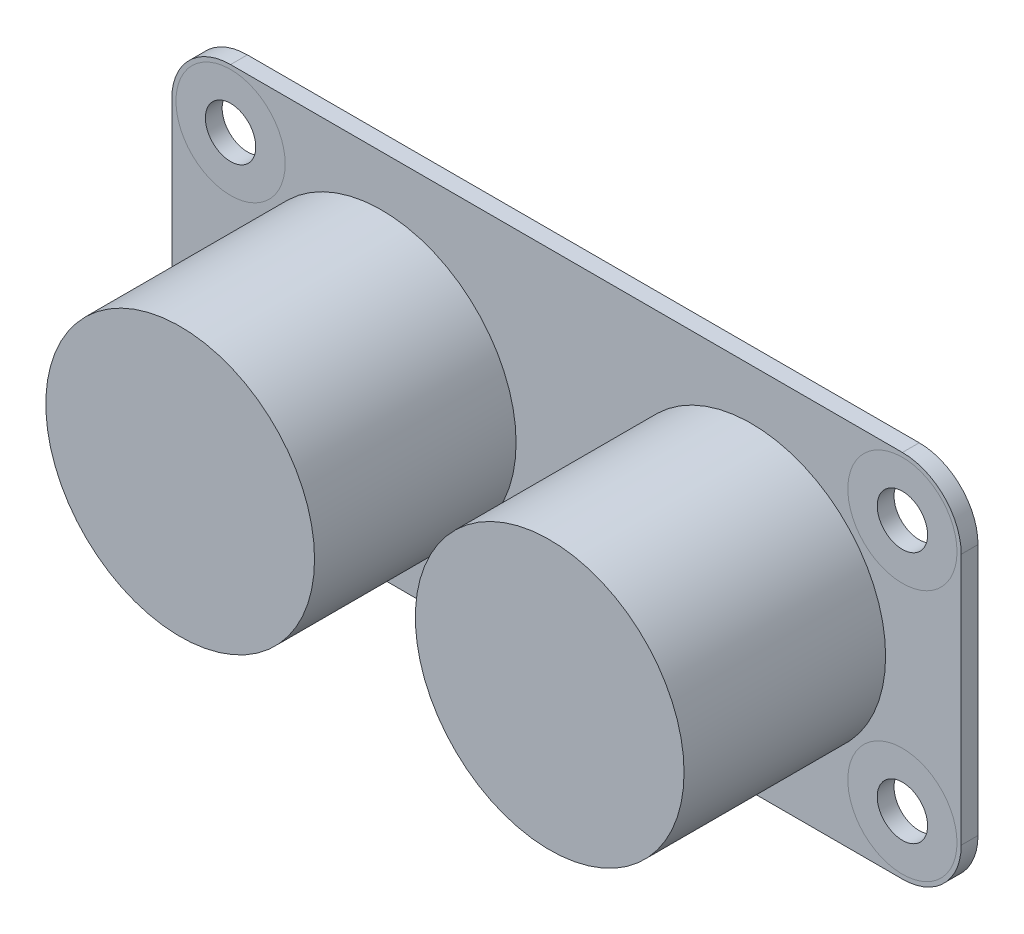
ISO-10303-21;
HEADER;
FILE_DESCRIPTION(('STEP AP214'),'2;1');
FILE_NAME('part.step','',(''),(''),'','','');
FILE_SCHEMA(('AUTOMOTIVE_DESIGN { 1 0 10303 214 1 1 1 1 }'));
ENDSEC;
DATA;
#1=APPLICATION_CONTEXT('core data for automotive mechanical design processes');
#2=APPLICATION_PROTOCOL_DEFINITION('international standard','automotive_design',2000,#1);
#3=PRODUCT_CONTEXT('',#1,'mechanical');
#4=PRODUCT('Part','Part','',(#3));
#5=PRODUCT_RELATED_PRODUCT_CATEGORY('part','',(#4));
#6=PRODUCT_DEFINITION_FORMATION('','',#4);
#7=PRODUCT_DEFINITION_CONTEXT('part definition',#1,'design');
#8=PRODUCT_DEFINITION('design','',#6,#7);
#9=PRODUCT_DEFINITION_SHAPE('','',#8);
#10=(LENGTH_UNIT() NAMED_UNIT(*) SI_UNIT(.MILLI.,.METRE.));
#11=(NAMED_UNIT(*) PLANE_ANGLE_UNIT() SI_UNIT($,.RADIAN.));
#12=(NAMED_UNIT(*) SI_UNIT($,.STERADIAN.) SOLID_ANGLE_UNIT());
#13=UNCERTAINTY_MEASURE_WITH_UNIT(LENGTH_MEASURE(1.E-05),#10,'distance_accuracy_value','');
#14=(GEOMETRIC_REPRESENTATION_CONTEXT(3) GLOBAL_UNCERTAINTY_ASSIGNED_CONTEXT((#13)) GLOBAL_UNIT_ASSIGNED_CONTEXT((#10,
#11,#12)) REPRESENTATION_CONTEXT('',''));
#15=CARTESIAN_POINT('',(0.,0.,0.));
#16=DIRECTION('',(0.,0.,1.));
#17=DIRECTION('',(1.,0.,0.));
#18=AXIS2_PLACEMENT_3D('',#15,#16,#17);
#19=CARTESIAN_POINT('',(0.,0.,0.));
#20=DIRECTION('',(0.,0.,1.));
#21=DIRECTION('',(1.,0.,0.));
#22=AXIS2_PLACEMENT_3D('',#19,#20,#21);
#23=PLANE('',#22);
#24=CARTESIAN_POINT('',(-20.,-7.5,0.));
#25=DIRECTION('',(0.,0.,1.));
#26=DIRECTION('',(1.,0.,0.));
#27=AXIS2_PLACEMENT_3D('',#24,#25,#26);
#28=CIRCLE('',#27,3.25);
#29=CARTESIAN_POINT('',(-16.75,-7.5,0.));
#30=VERTEX_POINT('',#29);
#31=EDGE_CURVE('E332',#30,#30,#28,.F.);
#32=ORIENTED_EDGE('',*,*,#31,.F.);
#33=EDGE_LOOP('',(#32));
#34=FACE_BOUND('',#33,.T.);
#35=CARTESIAN_POINT('',(20.,7.5,0.));
#36=DIRECTION('',(0.,0.,1.));
#37=DIRECTION('',(1.,0.,0.));
#38=AXIS2_PLACEMENT_3D('',#35,#36,#37);
#39=CIRCLE('',#38,3.25);
#40=CARTESIAN_POINT('',(23.25,7.5,0.));
#41=VERTEX_POINT('',#40);
#42=EDGE_CURVE('E316',#41,#41,#39,.F.);
#43=ORIENTED_EDGE('',*,*,#42,.F.);
#44=EDGE_LOOP('',(#43));
#45=FACE_BOUND('',#44,.T.);
#46=CARTESIAN_POINT('',(-20.,7.5,0.));
#47=DIRECTION('',(0.,0.,1.));
#48=DIRECTION('',(1.,0.,0.));
#49=AXIS2_PLACEMENT_3D('',#46,#47,#48);
#50=CIRCLE('',#49,3.25);
#51=CARTESIAN_POINT('',(-16.75,7.5,0.));
#52=VERTEX_POINT('',#51);
#53=EDGE_CURVE('E308',#52,#52,#50,.F.);
#54=ORIENTED_EDGE('',*,*,#53,.F.);
#55=EDGE_LOOP('',(#54));
#56=FACE_BOUND('',#55,.T.);
#57=CARTESIAN_POINT('',(20.,-7.5,0.));
#58=DIRECTION('',(0.,0.,1.));
#59=DIRECTION('',(1.,0.,0.));
#60=AXIS2_PLACEMENT_3D('',#57,#58,#59);
#61=CIRCLE('',#60,3.25);
#62=CARTESIAN_POINT('',(23.25,-7.5,0.));
#63=VERTEX_POINT('',#62);
#64=EDGE_CURVE('E324',#63,#63,#61,.F.);
#65=ORIENTED_EDGE('',*,*,#64,.F.);
#66=EDGE_LOOP('',(#65));
#67=FACE_BOUND('',#66,.T.);
#68=DIRECTION('',(0.,-1.,0.));
#69=VECTOR('',#68,1.);
#70=CARTESIAN_POINT('',(5.,-11.,0.));
#71=LINE('',#70,#69);
#72=CARTESIAN_POINT('',(5.,-4.99999999999999,0.));
#73=VERTEX_POINT('',#72);
#74=CARTESIAN_POINT('',(5.,-11.,0.));
#75=VERTEX_POINT('',#74);
#76=EDGE_CURVE('E179',#73,#75,#71,.T.);
#77=ORIENTED_EDGE('',*,*,#76,.F.);
#78=DIRECTION('',(1.,0.,0.));
#79=VECTOR('',#78,1.);
#80=CARTESIAN_POINT('',(-5.,-4.99999999999999,0.));
#81=LINE('',#80,#79);
#82=CARTESIAN_POINT('',(-5.,-4.99999999999999,0.));
#83=VERTEX_POINT('',#82);
#84=EDGE_CURVE('E195',#83,#73,#81,.T.);
#85=ORIENTED_EDGE('',*,*,#84,.F.);
#86=DIRECTION('',(0.,1.,0.));
#87=VECTOR('',#86,1.);
#88=CARTESIAN_POINT('',(-5.,-11.,0.));
#89=LINE('',#88,#87);
#90=CARTESIAN_POINT('',(-5.,-11.,0.));
#91=VERTEX_POINT('',#90);
#92=EDGE_CURVE('E184',#91,#83,#89,.T.);
#93=ORIENTED_EDGE('',*,*,#92,.F.);
#94=DIRECTION('',(-1.,0.,0.));
#95=VECTOR('',#94,1.);
#96=CARTESIAN_POINT('',(0.,-11.,0.));
#97=LINE('',#96,#95);
#98=CARTESIAN_POINT('',(-20.,-11.,0.));
#99=VERTEX_POINT('',#98);
#100=EDGE_CURVE('E297',#91,#99,#97,.T.);
#101=ORIENTED_EDGE('',*,*,#100,.T.);
#102=CARTESIAN_POINT('',(-20.,-7.5,0.));
#103=DIRECTION('',(0.,0.,1.));
#104=DIRECTION('',(1.,0.,0.));
#105=AXIS2_PLACEMENT_3D('',#102,#103,#104);
#106=CIRCLE('',#105,3.5);
#107=CARTESIAN_POINT('',(-23.5,-7.5,0.));
#108=VERTEX_POINT('',#107);
#109=EDGE_CURVE('E355',#99,#108,#106,.F.);
#110=ORIENTED_EDGE('',*,*,#109,.T.);
#111=DIRECTION('',(0.,1.,0.));
#112=VECTOR('',#111,1.);
#113=CARTESIAN_POINT('',(-23.5,0.,0.));
#114=LINE('',#113,#112);
#115=CARTESIAN_POINT('',(-23.5,7.5,0.));
#116=VERTEX_POINT('',#115);
#117=EDGE_CURVE('E271',#108,#116,#114,.T.);
#118=ORIENTED_EDGE('',*,*,#117,.T.);
#119=CARTESIAN_POINT('',(-20.,7.5,0.));
#120=DIRECTION('',(0.,0.,1.));
#121=DIRECTION('',(1.,0.,0.));
#122=AXIS2_PLACEMENT_3D('',#119,#120,#121);
#123=CIRCLE('',#122,3.5);
#124=CARTESIAN_POINT('',(-20.,11.,0.));
#125=VERTEX_POINT('',#124);
#126=EDGE_CURVE('E349',#116,#125,#123,.F.);
#127=ORIENTED_EDGE('',*,*,#126,.T.);
#128=DIRECTION('',(-1.,0.,0.));
#129=VECTOR('',#128,1.);
#130=CARTESIAN_POINT('',(0.,11.,0.));
#131=LINE('',#130,#129);
#132=CARTESIAN_POINT('',(20.,11.,0.));
#133=VERTEX_POINT('',#132);
#134=EDGE_CURVE('E283',#133,#125,#131,.T.);
#135=ORIENTED_EDGE('',*,*,#134,.F.);
#136=CARTESIAN_POINT('',(20.,7.5,0.));
#137=DIRECTION('',(0.,0.,1.));
#138=DIRECTION('',(1.,0.,0.));
#139=AXIS2_PLACEMENT_3D('',#136,#137,#138);
#140=CIRCLE('',#139,3.5);
#141=CARTESIAN_POINT('',(23.5,7.5,0.));
#142=VERTEX_POINT('',#141);
#143=EDGE_CURVE('E346',#133,#142,#140,.F.);
#144=ORIENTED_EDGE('',*,*,#143,.T.);
#145=DIRECTION('',(0.,1.,0.));
#146=VECTOR('',#145,1.);
#147=CARTESIAN_POINT('',(23.5,0.,0.));
#148=LINE('',#147,#146);
#149=CARTESIAN_POINT('',(23.5,-7.5,0.));
#150=VERTEX_POINT('',#149);
#151=EDGE_CURVE('E301',#150,#142,#148,.T.);
#152=ORIENTED_EDGE('',*,*,#151,.F.);
#153=CARTESIAN_POINT('',(20.,-7.5,0.));
#154=DIRECTION('',(0.,0.,1.));
#155=DIRECTION('',(1.,0.,0.));
#156=AXIS2_PLACEMENT_3D('',#153,#154,#155);
#157=CIRCLE('',#156,3.5);
#158=CARTESIAN_POINT('',(20.,-11.,0.));
#159=VERTEX_POINT('',#158);
#160=EDGE_CURVE('E352',#150,#159,#157,.F.);
#161=ORIENTED_EDGE('',*,*,#160,.T.);
#162=EDGE_CURVE('E298',#159,#75,#97,.T.);
#163=ORIENTED_EDGE('',*,*,#162,.T.);
#164=EDGE_LOOP('',(#77,#85,#93,#101,#110,#118,#127,#135,#144,#152,#161,#163));
#165=FACE_BOUND('',#164,.T.);
#166=ADVANCED_FACE('F43',(#34,#45,#56,#67,#165),#23,.F.);
#167=CARTESIAN_POINT('',(0.,0.,1.));
#168=DIRECTION('',(0.,0.,1.));
#169=DIRECTION('',(1.,0.,0.));
#170=AXIS2_PLACEMENT_3D('',#167,#168,#169);
#171=PLANE('',#170);
#172=CARTESIAN_POINT('',(20.,-7.5,1.));
#173=DIRECTION('',(0.,0.,1.));
#174=DIRECTION('',(1.,0.,0.));
#175=AXIS2_PLACEMENT_3D('',#172,#173,#174);
#176=CIRCLE('',#175,3.25);
#177=CARTESIAN_POINT('',(23.25,-7.5,1.));
#178=VERTEX_POINT('',#177);
#179=EDGE_CURVE('E320',#178,#178,#176,.F.);
#180=ORIENTED_EDGE('',*,*,#179,.T.);
#181=EDGE_LOOP('',(#180));
#182=FACE_BOUND('',#181,.T.);
#183=CARTESIAN_POINT('',(-20.,7.5,1.));
#184=DIRECTION('',(0.,0.,1.));
#185=DIRECTION('',(1.,0.,0.));
#186=AXIS2_PLACEMENT_3D('',#183,#184,#185);
#187=CIRCLE('',#186,3.25);
#188=CARTESIAN_POINT('',(-16.75,7.5,1.));
#189=VERTEX_POINT('',#188);
#190=EDGE_CURVE('E276',#189,#189,#187,.F.);
#191=ORIENTED_EDGE('',*,*,#190,.T.);
#192=EDGE_LOOP('',(#191));
#193=FACE_BOUND('',#192,.T.);
#194=CARTESIAN_POINT('',(-11.,0.,1.));
#195=DIRECTION('',(0.,0.,1.));
#196=DIRECTION('',(1.,0.,0.));
#197=AXIS2_PLACEMENT_3D('',#194,#195,#196);
#198=CIRCLE('',#197,8.);
#199=CARTESIAN_POINT('',(-3.,0.,1.));
#200=VERTEX_POINT('',#199);
#201=EDGE_CURVE('E260',#200,#200,#198,.T.);
#202=ORIENTED_EDGE('',*,*,#201,.F.);
#203=EDGE_LOOP('',(#202));
#204=FACE_BOUND('',#203,.T.);
#205=CARTESIAN_POINT('',(11.,0.,1.));
#206=DIRECTION('',(0.,0.,1.));
#207=DIRECTION('',(1.,0.,0.));
#208=AXIS2_PLACEMENT_3D('',#205,#206,#207);
#209=CIRCLE('',#208,8.);
#210=CARTESIAN_POINT('',(19.,0.,1.));
#211=VERTEX_POINT('',#210);
#212=EDGE_CURVE('E272',#211,#211,#209,.T.);
#213=ORIENTED_EDGE('',*,*,#212,.F.);
#214=EDGE_LOOP('',(#213));
#215=FACE_BOUND('',#214,.T.);
#216=DIRECTION('',(0.,1.,0.));
#217=VECTOR('',#216,1.);
#218=CARTESIAN_POINT('',(-23.5,0.,1.));
#219=LINE('',#218,#217);
#220=CARTESIAN_POINT('',(-23.5,-7.5,1.));
#221=VERTEX_POINT('',#220);
#222=CARTESIAN_POINT('',(-23.5,7.5,1.));
#223=VERTEX_POINT('',#222);
#224=EDGE_CURVE('E278',#221,#223,#219,.T.);
#225=ORIENTED_EDGE('',*,*,#224,.F.);
#226=CARTESIAN_POINT('',(-20.,-7.5,1.));
#227=DIRECTION('',(0.,0.,1.));
#228=DIRECTION('',(1.,0.,0.));
#229=AXIS2_PLACEMENT_3D('',#226,#227,#228);
#230=CIRCLE('',#229,3.5);
#231=CARTESIAN_POINT('',(-20.,-11.,1.));
#232=VERTEX_POINT('',#231);
#233=EDGE_CURVE('E374',#221,#232,#230,.T.);
#234=ORIENTED_EDGE('',*,*,#233,.T.);
#235=DIRECTION('',(-1.,0.,0.));
#236=VECTOR('',#235,1.);
#237=CARTESIAN_POINT('',(0.,-11.,1.));
#238=LINE('',#237,#236);
#239=CARTESIAN_POINT('',(20.,-11.,1.));
#240=VERTEX_POINT('',#239);
#241=EDGE_CURVE('E282',#240,#232,#238,.T.);
#242=ORIENTED_EDGE('',*,*,#241,.F.);
#243=CARTESIAN_POINT('',(20.,-7.5,1.));
#244=DIRECTION('',(0.,0.,1.));
#245=DIRECTION('',(1.,0.,0.));
#246=AXIS2_PLACEMENT_3D('',#243,#244,#245);
#247=CIRCLE('',#246,3.5);
#248=CARTESIAN_POINT('',(23.5,-7.5,1.));
#249=VERTEX_POINT('',#248);
#250=EDGE_CURVE('E371',#240,#249,#247,.T.);
#251=ORIENTED_EDGE('',*,*,#250,.T.);
#252=DIRECTION('',(0.,1.,0.));
#253=VECTOR('',#252,1.);
#254=CARTESIAN_POINT('',(23.5,0.,1.));
#255=LINE('',#254,#253);
#256=CARTESIAN_POINT('',(23.5,7.5,1.));
#257=VERTEX_POINT('',#256);
#258=EDGE_CURVE('E287',#249,#257,#255,.T.);
#259=ORIENTED_EDGE('',*,*,#258,.T.);
#260=CARTESIAN_POINT('',(20.,7.5,1.));
#261=DIRECTION('',(0.,0.,1.));
#262=DIRECTION('',(1.,0.,0.));
#263=AXIS2_PLACEMENT_3D('',#260,#261,#262);
#264=CIRCLE('',#263,3.5);
#265=CARTESIAN_POINT('',(20.,11.,1.));
#266=VERTEX_POINT('',#265);
#267=EDGE_CURVE('E365',#257,#266,#264,.T.);
#268=ORIENTED_EDGE('',*,*,#267,.T.);
#269=DIRECTION('',(-1.,0.,0.));
#270=VECTOR('',#269,1.);
#271=CARTESIAN_POINT('',(0.,11.,1.));
#272=LINE('',#271,#270);
#273=CARTESIAN_POINT('',(-20.,11.,1.));
#274=VERTEX_POINT('',#273);
#275=EDGE_CURVE('E277',#266,#274,#272,.T.);
#276=ORIENTED_EDGE('',*,*,#275,.T.);
#277=CARTESIAN_POINT('',(-20.,7.5,1.));
#278=DIRECTION('',(0.,0.,1.));
#279=DIRECTION('',(1.,0.,0.));
#280=AXIS2_PLACEMENT_3D('',#277,#278,#279);
#281=CIRCLE('',#280,3.5);
#282=EDGE_CURVE('E368',#274,#223,#281,.T.);
#283=ORIENTED_EDGE('',*,*,#282,.T.);
#284=EDGE_LOOP('',(#225,#234,#242,#251,#259,#268,#276,#283));
#285=FACE_BOUND('',#284,.T.);
#286=CARTESIAN_POINT('',(20.,7.5,1.));
#287=DIRECTION('',(0.,0.,1.));
#288=DIRECTION('',(1.,0.,0.));
#289=AXIS2_PLACEMENT_3D('',#286,#287,#288);
#290=CIRCLE('',#289,3.25);
#291=CARTESIAN_POINT('',(23.25,7.5,1.));
#292=VERTEX_POINT('',#291);
#293=EDGE_CURVE('E312',#292,#292,#290,.F.);
#294=ORIENTED_EDGE('',*,*,#293,.T.);
#295=EDGE_LOOP('',(#294));
#296=FACE_BOUND('',#295,.T.);
#297=CARTESIAN_POINT('',(-20.,-7.5,1.));
#298=DIRECTION('',(0.,0.,1.));
#299=DIRECTION('',(1.,0.,0.));
#300=AXIS2_PLACEMENT_3D('',#297,#298,#299);
#301=CIRCLE('',#300,3.25);
#302=CARTESIAN_POINT('',(-16.75,-7.5,1.));
#303=VERTEX_POINT('',#302);
#304=EDGE_CURVE('E328',#303,#303,#301,.F.);
#305=ORIENTED_EDGE('',*,*,#304,.T.);
#306=EDGE_LOOP('',(#305));
#307=FACE_BOUND('',#306,.T.);
#308=ADVANCED_FACE('F406',(#182,#193,#204,#215,#285,#296,#307),#171,.T.);
#309=ORIENTED_EDGE('',*,*,#31,.T.);
#310=EDGE_LOOP('',(#309));
#311=FACE_BOUND('',#310,.T.);
#312=CARTESIAN_POINT('',(-20.,-7.5,0.));
#313=DIRECTION('',(0.,0.,1.));
#314=DIRECTION('',(1.,0.,0.));
#315=AXIS2_PLACEMENT_3D('',#312,#313,#314);
#316=CIRCLE('',#315,1.5);
#317=CARTESIAN_POINT('',(-18.5,-7.5,0.));
#318=VERTEX_POINT('',#317);
#319=EDGE_CURVE('E238',#318,#318,#316,.T.);
#320=ORIENTED_EDGE('',*,*,#319,.T.);
#321=EDGE_LOOP('',(#320));
#322=FACE_BOUND('',#321,.T.);
#323=ADVANCED_FACE('F517',(#311,#322),#23,.F.);
#324=ORIENTED_EDGE('',*,*,#304,.F.);
#325=EDGE_LOOP('',(#324));
#326=FACE_BOUND('',#325,.T.);
#327=CARTESIAN_POINT('',(-20.,-7.5,1.));
#328=DIRECTION('',(0.,0.,1.));
#329=DIRECTION('',(1.,0.,0.));
#330=AXIS2_PLACEMENT_3D('',#327,#328,#329);
#331=CIRCLE('',#330,1.5);
#332=CARTESIAN_POINT('',(-18.5,-7.5,1.));
#333=VERTEX_POINT('',#332);
#334=EDGE_CURVE('E233',#333,#333,#331,.T.);
#335=ORIENTED_EDGE('',*,*,#334,.F.);
#336=EDGE_LOOP('',(#335));
#337=FACE_BOUND('',#336,.T.);
#338=ADVANCED_FACE('F526',(#326,#337),#171,.T.);
#339=ORIENTED_EDGE('',*,*,#64,.T.);
#340=EDGE_LOOP('',(#339));
#341=FACE_BOUND('',#340,.T.);
#342=CARTESIAN_POINT('',(20.,-7.5,0.));
#343=DIRECTION('',(0.,0.,1.));
#344=DIRECTION('',(1.,0.,0.));
#345=AXIS2_PLACEMENT_3D('',#342,#343,#344);
#346=CIRCLE('',#345,1.5);
#347=CARTESIAN_POINT('',(21.5,-7.5,0.));
#348=VERTEX_POINT('',#347);
#349=EDGE_CURVE('E227',#348,#348,#346,.T.);
#350=ORIENTED_EDGE('',*,*,#349,.T.);
#351=EDGE_LOOP('',(#350));
#352=FACE_BOUND('',#351,.T.);
#353=ADVANCED_FACE('F533',(#341,#352),#23,.F.);
#354=ORIENTED_EDGE('',*,*,#179,.F.);
#355=EDGE_LOOP('',(#354));
#356=FACE_BOUND('',#355,.T.);
#357=CARTESIAN_POINT('',(20.,-7.5,1.));
#358=DIRECTION('',(0.,0.,1.));
#359=DIRECTION('',(1.,0.,0.));
#360=AXIS2_PLACEMENT_3D('',#357,#358,#359);
#361=CIRCLE('',#360,1.5);
#362=CARTESIAN_POINT('',(21.5,-7.5,1.));
#363=VERTEX_POINT('',#362);
#364=EDGE_CURVE('E242',#363,#363,#361,.T.);
#365=ORIENTED_EDGE('',*,*,#364,.F.);
#366=EDGE_LOOP('',(#365));
#367=FACE_BOUND('',#366,.T.);
#368=ADVANCED_FACE('F550',(#356,#367),#171,.T.);
#369=ORIENTED_EDGE('',*,*,#42,.T.);
#370=EDGE_LOOP('',(#369));
#371=FACE_BOUND('',#370,.T.);
#372=CARTESIAN_POINT('',(20.,7.5,0.));
#373=DIRECTION('',(0.,0.,1.));
#374=DIRECTION('',(1.,0.,0.));
#375=AXIS2_PLACEMENT_3D('',#372,#373,#374);
#376=CIRCLE('',#375,1.5);
#377=CARTESIAN_POINT('',(21.5,7.5,0.));
#378=VERTEX_POINT('',#377);
#379=EDGE_CURVE('E237',#378,#378,#376,.T.);
#380=ORIENTED_EDGE('',*,*,#379,.T.);
#381=EDGE_LOOP('',(#380));
#382=FACE_BOUND('',#381,.T.);
#383=ADVANCED_FACE('F537',(#371,#382),#23,.F.);
#384=ORIENTED_EDGE('',*,*,#293,.F.);
#385=EDGE_LOOP('',(#384));
#386=FACE_BOUND('',#385,.T.);
#387=CARTESIAN_POINT('',(20.,7.5,1.));
#388=DIRECTION('',(0.,0.,1.));
#389=DIRECTION('',(1.,0.,0.));
#390=AXIS2_PLACEMENT_3D('',#387,#388,#389);
#391=CIRCLE('',#390,1.5);
#392=CARTESIAN_POINT('',(21.5,7.5,1.));
#393=VERTEX_POINT('',#392);
#394=EDGE_CURVE('E255',#393,#393,#391,.T.);
#395=ORIENTED_EDGE('',*,*,#394,.F.);
#396=EDGE_LOOP('',(#395));
#397=FACE_BOUND('',#396,.T.);
#398=ADVANCED_FACE('F547',(#386,#397),#171,.T.);
#399=CARTESIAN_POINT('',(-23.5,0.,1.));
#400=DIRECTION('',(-1.,0.,0.));
#401=DIRECTION('',(0.,0.,1.));
#402=AXIS2_PLACEMENT_3D('',#399,#400,#401);
#403=PLANE('',#402);
#404=ORIENTED_EDGE('',*,*,#117,.F.);
#405=DIRECTION('',(0.,0.,-1.));
#406=VECTOR('',#405,1.);
#407=CARTESIAN_POINT('',(-23.5,-7.5,1.));
#408=LINE('',#407,#406);
#409=EDGE_CURVE('E362',#108,#221,#408,.F.);
#410=ORIENTED_EDGE('',*,*,#409,.T.);
#411=ORIENTED_EDGE('',*,*,#224,.T.);
#412=DIRECTION('',(0.,0.,-1.));
#413=VECTOR('',#412,1.);
#414=CARTESIAN_POINT('',(-23.5,7.5,0.));
#415=LINE('',#414,#413);
#416=EDGE_CURVE('E358',#223,#116,#415,.T.);
#417=ORIENTED_EDGE('',*,*,#416,.T.);
#418=EDGE_LOOP('',(#404,#410,#411,#417));
#419=FACE_BOUND('',#418,.T.);
#420=ADVANCED_FACE('F401',(#419),#403,.T.);
#421=CARTESIAN_POINT('',(0.,-11.,1.));
#422=DIRECTION('',(0.,-1.,0.));
#423=DIRECTION('',(1.,0.,0.));
#424=AXIS2_PLACEMENT_3D('',#421,#422,#423);
#425=PLANE('',#424);
#426=ORIENTED_EDGE('',*,*,#241,.T.);
#427=DIRECTION('',(0.,0.,-1.));
#428=VECTOR('',#427,1.);
#429=CARTESIAN_POINT('',(-20.,-11.,1.));
#430=LINE('',#429,#428);
#431=EDGE_CURVE('E342',#232,#99,#430,.T.);
#432=ORIENTED_EDGE('',*,*,#431,.T.);
#433=ORIENTED_EDGE('',*,*,#100,.F.);
#434=DIRECTION('',(0.,0.,1.));
#435=VECTOR('',#434,1.);
#436=CARTESIAN_POINT('',(-5.,-11.,-6.));
#437=LINE('',#436,#435);
#438=CARTESIAN_POINT('',(-5.,-11.,-6.));
#439=VERTEX_POINT('',#438);
#440=EDGE_CURVE('E219',#439,#91,#437,.T.);
#441=ORIENTED_EDGE('',*,*,#440,.F.);
#442=DIRECTION('',(-1.,0.,0.));
#443=VECTOR('',#442,1.);
#444=CARTESIAN_POINT('',(-5.,-11.,-6.));
#445=LINE('',#444,#443);
#446=CARTESIAN_POINT('',(5.,-11.,-6.));
#447=VERTEX_POINT('',#446);
#448=EDGE_CURVE('E194',#447,#439,#445,.T.);
#449=ORIENTED_EDGE('',*,*,#448,.F.);
#450=DIRECTION('',(0.,0.,1.));
#451=VECTOR('',#450,1.);
#452=CARTESIAN_POINT('',(5.,-11.,-6.));
#453=LINE('',#452,#451);
#454=EDGE_CURVE('E223',#447,#75,#453,.T.);
#455=ORIENTED_EDGE('',*,*,#454,.T.);
#456=ORIENTED_EDGE('',*,*,#162,.F.);
#457=DIRECTION('',(0.,0.,-1.));
#458=VECTOR('',#457,1.);
#459=CARTESIAN_POINT('',(20.,-11.,1.));
#460=LINE('',#459,#458);
#461=EDGE_CURVE('E336',#159,#240,#460,.F.);
#462=ORIENTED_EDGE('',*,*,#461,.T.);
#463=EDGE_LOOP('',(#426,#432,#433,#441,#449,#455,#456,#462));
#464=FACE_BOUND('',#463,.T.);
#465=ADVANCED_FACE('F414',(#464),#425,.T.);
#466=CARTESIAN_POINT('',(23.5,0.,1.));
#467=DIRECTION('',(-1.,0.,0.));
#468=DIRECTION('',(0.,0.,1.));
#469=AXIS2_PLACEMENT_3D('',#466,#467,#468);
#470=PLANE('',#469);
#471=ORIENTED_EDGE('',*,*,#258,.F.);
#472=DIRECTION('',(0.,0.,-1.));
#473=VECTOR('',#472,1.);
#474=CARTESIAN_POINT('',(23.5,-7.5,0.));
#475=LINE('',#474,#473);
#476=EDGE_CURVE('E380',#249,#150,#475,.T.);
#477=ORIENTED_EDGE('',*,*,#476,.T.);
#478=ORIENTED_EDGE('',*,*,#151,.T.);
#479=DIRECTION('',(0.,0.,-1.));
#480=VECTOR('',#479,1.);
#481=CARTESIAN_POINT('',(23.5,7.5,1.));
#482=LINE('',#481,#480);
#483=EDGE_CURVE('E377',#142,#257,#482,.F.);
#484=ORIENTED_EDGE('',*,*,#483,.T.);
#485=EDGE_LOOP('',(#471,#477,#478,#484));
#486=FACE_BOUND('',#485,.T.);
#487=ADVANCED_FACE('F425',(#486),#470,.F.);
#488=CARTESIAN_POINT('',(0.,11.,1.));
#489=DIRECTION('',(0.,-1.,0.));
#490=DIRECTION('',(1.,0.,0.));
#491=AXIS2_PLACEMENT_3D('',#488,#489,#490);
#492=PLANE('',#491);
#493=ORIENTED_EDGE('',*,*,#134,.T.);
#494=DIRECTION('',(0.,0.,-1.));
#495=VECTOR('',#494,1.);
#496=CARTESIAN_POINT('',(-20.,11.,1.));
#497=LINE('',#496,#495);
#498=EDGE_CURVE('E11',#125,#274,#497,.F.);
#499=ORIENTED_EDGE('',*,*,#498,.T.);
#500=ORIENTED_EDGE('',*,*,#275,.F.);
#501=DIRECTION('',(0.,0.,-1.));
#502=VECTOR('',#501,1.);
#503=CARTESIAN_POINT('',(20.,11.,1.));
#504=LINE('',#503,#502);
#505=EDGE_CURVE('E52',#266,#133,#504,.T.);
#506=ORIENTED_EDGE('',*,*,#505,.T.);
#507=EDGE_LOOP('',(#493,#499,#500,#506));
#508=FACE_BOUND('',#507,.T.);
#509=ADVANCED_FACE('F389',(#508),#492,.F.);
#510=ORIENTED_EDGE('',*,*,#190,.F.);
#511=EDGE_LOOP('',(#510));
#512=FACE_BOUND('',#511,.T.);
#513=CARTESIAN_POINT('',(-20.,7.5,1.));
#514=DIRECTION('',(0.,0.,1.));
#515=DIRECTION('',(1.,0.,0.));
#516=AXIS2_PLACEMENT_3D('',#513,#514,#515);
#517=CIRCLE('',#516,1.5);
#518=CARTESIAN_POINT('',(-18.5,7.5,1.));
#519=VERTEX_POINT('',#518);
#520=EDGE_CURVE('E232',#519,#519,#517,.T.);
#521=ORIENTED_EDGE('',*,*,#520,.F.);
#522=EDGE_LOOP('',(#521));
#523=FACE_BOUND('',#522,.T.);
#524=ADVANCED_FACE('F527',(#512,#523),#171,.T.);
#525=ORIENTED_EDGE('',*,*,#53,.T.);
#526=EDGE_LOOP('',(#525));
#527=FACE_BOUND('',#526,.T.);
#528=CARTESIAN_POINT('',(-20.,7.5,0.));
#529=DIRECTION('',(0.,0.,1.));
#530=DIRECTION('',(1.,0.,0.));
#531=AXIS2_PLACEMENT_3D('',#528,#529,#530);
#532=CIRCLE('',#531,1.5);
#533=CARTESIAN_POINT('',(-18.5,7.5,0.));
#534=VERTEX_POINT('',#533);
#535=EDGE_CURVE('E228',#534,#534,#532,.T.);
#536=ORIENTED_EDGE('',*,*,#535,.T.);
#537=EDGE_LOOP('',(#536));
#538=FACE_BOUND('',#537,.T.);
#539=ADVANCED_FACE('F518',(#527,#538),#23,.F.);
#540=CARTESIAN_POINT('',(11.,0.,13.));
#541=DIRECTION('',(0.,0.,-1.));
#542=DIRECTION('',(-1.,0.,0.));
#543=AXIS2_PLACEMENT_3D('',#540,#541,#542);
#544=CYLINDRICAL_SURFACE('',#543,8.);
#545=CARTESIAN_POINT('',(11.,0.,13.));
#546=DIRECTION('',(0.,0.,1.));
#547=DIRECTION('',(1.,0.,0.));
#548=AXIS2_PLACEMENT_3D('',#545,#546,#547);
#549=CIRCLE('',#548,8.);
#550=CARTESIAN_POINT('',(19.,0.,13.));
#551=VERTEX_POINT('',#550);
#552=EDGE_CURVE('E264',#551,#551,#549,.T.);
#553=ORIENTED_EDGE('',*,*,#552,.F.);
#554=EDGE_LOOP('',(#553));
#555=FACE_BOUND('',#554,.T.);
#556=ORIENTED_EDGE('',*,*,#212,.T.);
#557=EDGE_LOOP('',(#556));
#558=FACE_BOUND('',#557,.T.);
#559=ADVANCED_FACE('F535',(#555,#558),#544,.T.);
#560=CARTESIAN_POINT('',(11.,0.,13.));
#561=DIRECTION('',(0.,0.,1.));
#562=DIRECTION('',(1.,0.,0.));
#563=AXIS2_PLACEMENT_3D('',#560,#561,#562);
#564=PLANE('',#563);
#565=ORIENTED_EDGE('',*,*,#552,.T.);
#566=EDGE_LOOP('',(#565));
#567=FACE_BOUND('',#566,.T.);
#568=ADVANCED_FACE('F543',(#567),#564,.T.);
#569=CARTESIAN_POINT('',(-11.,0.,13.));
#570=DIRECTION('',(0.,0.,-1.));
#571=DIRECTION('',(-1.,0.,0.));
#572=AXIS2_PLACEMENT_3D('',#569,#570,#571);
#573=CYLINDRICAL_SURFACE('',#572,8.);
#574=CARTESIAN_POINT('',(-11.,0.,13.));
#575=DIRECTION('',(0.,0.,1.));
#576=DIRECTION('',(1.,0.,0.));
#577=AXIS2_PLACEMENT_3D('',#574,#575,#576);
#578=CIRCLE('',#577,8.);
#579=CARTESIAN_POINT('',(-3.,0.,13.));
#580=VERTEX_POINT('',#579);
#581=EDGE_CURVE('E259',#580,#580,#578,.T.);
#582=ORIENTED_EDGE('',*,*,#581,.F.);
#583=EDGE_LOOP('',(#582));
#584=FACE_BOUND('',#583,.T.);
#585=ORIENTED_EDGE('',*,*,#201,.T.);
#586=EDGE_LOOP('',(#585));
#587=FACE_BOUND('',#586,.T.);
#588=ADVANCED_FACE('F590',(#584,#587),#573,.T.);
#589=CARTESIAN_POINT('',(-11.,0.,13.));
#590=DIRECTION('',(0.,0.,1.));
#591=DIRECTION('',(1.,0.,0.));
#592=AXIS2_PLACEMENT_3D('',#589,#590,#591);
#593=PLANE('',#592);
#594=ORIENTED_EDGE('',*,*,#581,.T.);
#595=EDGE_LOOP('',(#594));
#596=FACE_BOUND('',#595,.T.);
#597=ADVANCED_FACE('F588',(#596),#593,.T.);
#598=CARTESIAN_POINT('',(20.,7.5,5.24264068711929));
#599=DIRECTION('',(0.,0.,-1.));
#600=DIRECTION('',(-1.,0.,0.));
#601=AXIS2_PLACEMENT_3D('',#598,#599,#600);
#602=CYLINDRICAL_SURFACE('',#601,1.5);
#603=ORIENTED_EDGE('',*,*,#379,.F.);
#604=EDGE_LOOP('',(#603));
#605=FACE_BOUND('',#604,.T.);
#606=ORIENTED_EDGE('',*,*,#394,.T.);
#607=EDGE_LOOP('',(#606));
#608=FACE_BOUND('',#607,.T.);
#609=ADVANCED_FACE('F585',(#605,#608),#602,.F.);
#610=CARTESIAN_POINT('',(-20.,7.5,5.24264068711929));
#611=DIRECTION('',(0.,0.,-1.));
#612=DIRECTION('',(-1.,0.,0.));
#613=AXIS2_PLACEMENT_3D('',#610,#611,#612);
#614=CYLINDRICAL_SURFACE('',#613,1.5);
#615=ORIENTED_EDGE('',*,*,#535,.F.);
#616=EDGE_LOOP('',(#615));
#617=FACE_BOUND('',#616,.T.);
#618=ORIENTED_EDGE('',*,*,#520,.T.);
#619=EDGE_LOOP('',(#618));
#620=FACE_BOUND('',#619,.T.);
#621=ADVANCED_FACE('F580',(#617,#620),#614,.F.);
#622=CARTESIAN_POINT('',(-20.,-7.5,5.24264068711929));
#623=DIRECTION('',(0.,0.,-1.));
#624=DIRECTION('',(-1.,0.,0.));
#625=AXIS2_PLACEMENT_3D('',#622,#623,#624);
#626=CYLINDRICAL_SURFACE('',#625,1.5);
#627=ORIENTED_EDGE('',*,*,#319,.F.);
#628=EDGE_LOOP('',(#627));
#629=FACE_BOUND('',#628,.T.);
#630=ORIENTED_EDGE('',*,*,#334,.T.);
#631=EDGE_LOOP('',(#630));
#632=FACE_BOUND('',#631,.T.);
#633=ADVANCED_FACE('F571',(#629,#632),#626,.F.);
#634=CARTESIAN_POINT('',(20.,-7.5,5.24264068711929));
#635=DIRECTION('',(0.,0.,-1.));
#636=DIRECTION('',(-1.,0.,0.));
#637=AXIS2_PLACEMENT_3D('',#634,#635,#636);
#638=CYLINDRICAL_SURFACE('',#637,1.5);
#639=ORIENTED_EDGE('',*,*,#349,.F.);
#640=EDGE_LOOP('',(#639));
#641=FACE_BOUND('',#640,.T.);
#642=ORIENTED_EDGE('',*,*,#364,.T.);
#643=EDGE_LOOP('',(#642));
#644=FACE_BOUND('',#643,.T.);
#645=ADVANCED_FACE('F568',(#641,#644),#638,.F.);
#646=CARTESIAN_POINT('',(-20.,-7.5,1.));
#647=DIRECTION('',(0.,0.,-1.));
#648=DIRECTION('',(-1.,0.,0.));
#649=AXIS2_PLACEMENT_3D('',#646,#647,#648);
#650=CYLINDRICAL_SURFACE('',#649,3.5);
#651=ORIENTED_EDGE('',*,*,#233,.F.);
#652=ORIENTED_EDGE('',*,*,#409,.F.);
#653=ORIENTED_EDGE('',*,*,#109,.F.);
#654=ORIENTED_EDGE('',*,*,#431,.F.);
#655=EDGE_LOOP('',(#651,#652,#653,#654));
#656=FACE_BOUND('',#655,.T.);
#657=ADVANCED_FACE('F411',(#656),#650,.T.);
#658=CARTESIAN_POINT('',(20.,-7.5,1.));
#659=DIRECTION('',(0.,0.,1.));
#660=DIRECTION('',(1.,0.,0.));
#661=AXIS2_PLACEMENT_3D('',#658,#659,#660);
#662=CYLINDRICAL_SURFACE('',#661,3.5);
#663=ORIENTED_EDGE('',*,*,#250,.F.);
#664=ORIENTED_EDGE('',*,*,#461,.F.);
#665=ORIENTED_EDGE('',*,*,#160,.F.);
#666=ORIENTED_EDGE('',*,*,#476,.F.);
#667=EDGE_LOOP('',(#663,#664,#665,#666));
#668=FACE_BOUND('',#667,.T.);
#669=ADVANCED_FACE('F423',(#668),#662,.T.);
#670=CARTESIAN_POINT('',(-20.,7.5,1.));
#671=DIRECTION('',(0.,0.,1.));
#672=DIRECTION('',(1.,0.,0.));
#673=AXIS2_PLACEMENT_3D('',#670,#671,#672);
#674=CYLINDRICAL_SURFACE('',#673,3.5);
#675=ORIENTED_EDGE('',*,*,#282,.F.);
#676=ORIENTED_EDGE('',*,*,#498,.F.);
#677=ORIENTED_EDGE('',*,*,#126,.F.);
#678=ORIENTED_EDGE('',*,*,#416,.F.);
#679=EDGE_LOOP('',(#675,#676,#677,#678));
#680=FACE_BOUND('',#679,.T.);
#681=ADVANCED_FACE('F399',(#680),#674,.T.);
#682=CARTESIAN_POINT('',(20.,7.5,1.));
#683=DIRECTION('',(0.,0.,-1.));
#684=DIRECTION('',(-1.,0.,0.));
#685=AXIS2_PLACEMENT_3D('',#682,#683,#684);
#686=CYLINDRICAL_SURFACE('',#685,3.5);
#687=ORIENTED_EDGE('',*,*,#267,.F.);
#688=ORIENTED_EDGE('',*,*,#483,.F.);
#689=ORIENTED_EDGE('',*,*,#143,.F.);
#690=ORIENTED_EDGE('',*,*,#505,.F.);
#691=EDGE_LOOP('',(#687,#688,#689,#690));
#692=FACE_BOUND('',#691,.T.);
#693=ADVANCED_FACE('F45',(#692),#686,.T.);
#694=CARTESIAN_POINT('',(5.,-11.,-6.));
#695=DIRECTION('',(-1.,0.,0.));
#696=DIRECTION('',(0.,0.,1.));
#697=AXIS2_PLACEMENT_3D('',#694,#695,#696);
#698=PLANE('',#697);
#699=ORIENTED_EDGE('',*,*,#76,.T.);
#700=ORIENTED_EDGE('',*,*,#454,.F.);
#701=DIRECTION('',(0.,-1.,0.));
#702=VECTOR('',#701,1.);
#703=CARTESIAN_POINT('',(5.,-11.,-6.));
#704=LINE('',#703,#702);
#705=CARTESIAN_POINT('',(5.,-4.99999999999999,-6.));
#706=VERTEX_POINT('',#705);
#707=EDGE_CURVE('E190',#706,#447,#704,.T.);
#708=ORIENTED_EDGE('',*,*,#707,.F.);
#709=DIRECTION('',(0.,0.,1.));
#710=VECTOR('',#709,1.);
#711=CARTESIAN_POINT('',(5.,-4.99999999999999,-6.));
#712=LINE('',#711,#710);
#713=EDGE_CURVE('E204',#706,#73,#712,.T.);
#714=ORIENTED_EDGE('',*,*,#713,.T.);
#715=EDGE_LOOP('',(#699,#700,#708,#714));
#716=FACE_BOUND('',#715,.T.);
#717=ADVANCED_FACE('F430',(#716),#698,.F.);
#718=CARTESIAN_POINT('',(-5.,-11.,-6.));
#719=DIRECTION('',(1.,0.,0.));
#720=DIRECTION('',(0.,1.,0.));
#721=AXIS2_PLACEMENT_3D('',#718,#719,#720);
#722=PLANE('',#721);
#723=ORIENTED_EDGE('',*,*,#92,.T.);
#724=DIRECTION('',(0.,0.,1.));
#725=VECTOR('',#724,1.);
#726=CARTESIAN_POINT('',(-5.,-4.99999999999999,-6.));
#727=LINE('',#726,#725);
#728=CARTESIAN_POINT('',(-5.,-4.99999999999999,-6.));
#729=VERTEX_POINT('',#728);
#730=EDGE_CURVE('E215',#729,#83,#727,.T.);
#731=ORIENTED_EDGE('',*,*,#730,.F.);
#732=DIRECTION('',(0.,1.,0.));
#733=VECTOR('',#732,1.);
#734=CARTESIAN_POINT('',(-5.,-11.,-6.));
#735=LINE('',#734,#733);
#736=EDGE_CURVE('E198',#439,#729,#735,.T.);
#737=ORIENTED_EDGE('',*,*,#736,.F.);
#738=ORIENTED_EDGE('',*,*,#440,.T.);
#739=EDGE_LOOP('',(#723,#731,#737,#738));
#740=FACE_BOUND('',#739,.T.);
#741=ADVANCED_FACE('F439',(#740),#722,.F.);
#742=CARTESIAN_POINT('',(-5.,-4.99999999999999,-6.));
#743=DIRECTION('',(0.,-1.,0.));
#744=DIRECTION('',(0.,0.,-1.));
#745=AXIS2_PLACEMENT_3D('',#742,#743,#744);
#746=PLANE('',#745);
#747=ORIENTED_EDGE('',*,*,#84,.T.);
#748=ORIENTED_EDGE('',*,*,#713,.F.);
#749=DIRECTION('',(1.,0.,0.));
#750=VECTOR('',#749,1.);
#751=CARTESIAN_POINT('',(-5.,-4.99999999999999,-6.));
#752=LINE('',#751,#750);
#753=CARTESIAN_POINT('',(4.,-4.99999999999999,-6.));
#754=VERTEX_POINT('',#753);
#755=EDGE_CURVE('E201',#754,#706,#752,.T.);
#756=ORIENTED_EDGE('',*,*,#755,.F.);
#757=DIRECTION('',(0.,0.,1.));
#758=VECTOR('',#757,1.);
#759=CARTESIAN_POINT('',(4.,-4.99999999999999,-8.5));
#760=LINE('',#759,#758);
#761=CARTESIAN_POINT('',(4.,-4.99999999999999,-8.5));
#762=VERTEX_POINT('',#761);
#763=EDGE_CURVE('E443',#762,#754,#760,.T.);
#764=ORIENTED_EDGE('',*,*,#763,.F.);
#765=DIRECTION('',(1.,0.,0.));
#766=VECTOR('',#765,1.);
#767=CARTESIAN_POINT('',(-4.,-4.99999999999999,-8.5));
#768=LINE('',#767,#766);
#769=CARTESIAN_POINT('',(-4.,-4.99999999999999,-8.5));
#770=VERTEX_POINT('',#769);
#771=EDGE_CURVE('E170',#770,#762,#768,.T.);
#772=ORIENTED_EDGE('',*,*,#771,.F.);
#773=DIRECTION('',(0.,0.,1.));
#774=VECTOR('',#773,1.);
#775=CARTESIAN_POINT('',(-4.,-4.99999999999999,-8.5));
#776=LINE('',#775,#774);
#777=CARTESIAN_POINT('',(-4.,-4.99999999999999,-6.));
#778=VERTEX_POINT('',#777);
#779=EDGE_CURVE('E186',#770,#778,#776,.T.);
#780=ORIENTED_EDGE('',*,*,#779,.T.);
#781=EDGE_CURVE('E202',#729,#778,#752,.T.);
#782=ORIENTED_EDGE('',*,*,#781,.F.);
#783=ORIENTED_EDGE('',*,*,#730,.T.);
#784=EDGE_LOOP('',(#747,#748,#756,#764,#772,#780,#782,#783));
#785=FACE_BOUND('',#784,.T.);
#786=ADVANCED_FACE('F433',(#785),#746,.F.);
#787=CARTESIAN_POINT('',(0.,0.,-6.));
#788=DIRECTION('',(0.,0.,-1.));
#789=DIRECTION('',(-1.,0.,0.));
#790=AXIS2_PLACEMENT_3D('',#787,#788,#789);
#791=PLANE('',#790);
#792=DIRECTION('',(0.,-1.,0.));
#793=VECTOR('',#792,1.);
#794=CARTESIAN_POINT('',(4.,-10.,-6.));
#795=LINE('',#794,#793);
#796=CARTESIAN_POINT('',(4.,-10.,-6.));
#797=VERTEX_POINT('',#796);
#798=EDGE_CURVE('E64',#754,#797,#795,.T.);
#799=ORIENTED_EDGE('',*,*,#798,.F.);
#800=ORIENTED_EDGE('',*,*,#755,.T.);
#801=ORIENTED_EDGE('',*,*,#707,.T.);
#802=ORIENTED_EDGE('',*,*,#448,.T.);
#803=ORIENTED_EDGE('',*,*,#736,.T.);
#804=ORIENTED_EDGE('',*,*,#781,.T.);
#805=DIRECTION('',(0.,1.,0.));
#806=VECTOR('',#805,1.);
#807=CARTESIAN_POINT('',(-4.,-9.99999999999999,-6.));
#808=LINE('',#807,#806);
#809=CARTESIAN_POINT('',(-4.,-9.99999999999999,-6.));
#810=VERTEX_POINT('',#809);
#811=EDGE_CURVE('E175',#810,#778,#808,.T.);
#812=ORIENTED_EDGE('',*,*,#811,.F.);
#813=DIRECTION('',(-1.,0.,0.));
#814=VECTOR('',#813,1.);
#815=CARTESIAN_POINT('',(-4.,-9.99999999999999,-6.));
#816=LINE('',#815,#814);
#817=EDGE_CURVE('E59',#797,#810,#816,.T.);
#818=ORIENTED_EDGE('',*,*,#817,.F.);
#819=EDGE_LOOP('',(#799,#800,#801,#802,#803,#804,#812,#818));
#820=FACE_BOUND('',#819,.T.);
#821=ADVANCED_FACE('F442',(#820),#791,.T.);
#822=CARTESIAN_POINT('',(4.,-10.,-8.5));
#823=DIRECTION('',(-1.,0.,0.));
#824=DIRECTION('',(0.,0.,1.));
#825=AXIS2_PLACEMENT_3D('',#822,#823,#824);
#826=PLANE('',#825);
#827=ORIENTED_EDGE('',*,*,#798,.T.);
#828=DIRECTION('',(0.,0.,1.));
#829=VECTOR('',#828,1.);
#830=CARTESIAN_POINT('',(4.,-10.,-8.5));
#831=LINE('',#830,#829);
#832=CARTESIAN_POINT('',(4.,-10.,-8.5));
#833=VERTEX_POINT('',#832);
#834=EDGE_CURVE('E158',#833,#797,#831,.T.);
#835=ORIENTED_EDGE('',*,*,#834,.F.);
#836=DIRECTION('',(0.,-1.,0.));
#837=VECTOR('',#836,1.);
#838=CARTESIAN_POINT('',(4.,-10.,-8.5));
#839=LINE('',#838,#837);
#840=EDGE_CURVE('E165',#762,#833,#839,.T.);
#841=ORIENTED_EDGE('',*,*,#840,.F.);
#842=ORIENTED_EDGE('',*,*,#763,.T.);
#843=EDGE_LOOP('',(#827,#835,#841,#842));
#844=FACE_BOUND('',#843,.T.);
#845=ADVANCED_FACE('F177',(#844),#826,.F.);
#846=CARTESIAN_POINT('',(-4.,-9.99999999999999,-8.5));
#847=DIRECTION('',(0.,1.,0.));
#848=DIRECTION('',(-1.,0.,0.));
#849=AXIS2_PLACEMENT_3D('',#846,#847,#848);
#850=PLANE('',#849);
#851=ORIENTED_EDGE('',*,*,#817,.T.);
#852=DIRECTION('',(0.,0.,1.));
#853=VECTOR('',#852,1.);
#854=CARTESIAN_POINT('',(-4.,-9.99999999999999,-8.5));
#855=LINE('',#854,#853);
#856=CARTESIAN_POINT('',(-4.,-9.99999999999999,-8.5));
#857=VERTEX_POINT('',#856);
#858=EDGE_CURVE('E160',#857,#810,#855,.T.);
#859=ORIENTED_EDGE('',*,*,#858,.F.);
#860=DIRECTION('',(-1.,0.,0.));
#861=VECTOR('',#860,1.);
#862=CARTESIAN_POINT('',(-4.,-9.99999999999999,-8.5));
#863=LINE('',#862,#861);
#864=EDGE_CURVE('E154',#833,#857,#863,.T.);
#865=ORIENTED_EDGE('',*,*,#864,.F.);
#866=ORIENTED_EDGE('',*,*,#834,.T.);
#867=EDGE_LOOP('',(#851,#859,#865,#866));
#868=FACE_BOUND('',#867,.T.);
#869=ADVANCED_FACE('F156',(#868),#850,.F.);
#870=CARTESIAN_POINT('',(-4.,-9.99999999999999,-8.5));
#871=DIRECTION('',(1.,0.,0.));
#872=DIRECTION('',(0.,0.,-1.));
#873=AXIS2_PLACEMENT_3D('',#870,#871,#872);
#874=PLANE('',#873);
#875=ORIENTED_EDGE('',*,*,#811,.T.);
#876=ORIENTED_EDGE('',*,*,#779,.F.);
#877=DIRECTION('',(0.,1.,0.));
#878=VECTOR('',#877,1.);
#879=CARTESIAN_POINT('',(-4.,-9.99999999999999,-8.5));
#880=LINE('',#879,#878);
#881=EDGE_CURVE('E164',#857,#770,#880,.T.);
#882=ORIENTED_EDGE('',*,*,#881,.F.);
#883=ORIENTED_EDGE('',*,*,#858,.T.);
#884=EDGE_LOOP('',(#875,#876,#882,#883));
#885=FACE_BOUND('',#884,.T.);
#886=ADVANCED_FACE('F496',(#885),#874,.F.);
#887=CARTESIAN_POINT('',(0.,0.,-8.5));
#888=DIRECTION('',(0.,0.,-1.));
#889=DIRECTION('',(-1.,0.,0.));
#890=AXIS2_PLACEMENT_3D('',#887,#888,#889);
#891=PLANE('',#890);
#892=CARTESIAN_POINT('',(-2.,-7.99999999999999,-8.5));
#893=DIRECTION('',(0.,0.,-1.));
#894=DIRECTION('',(-1.,0.,0.));
#895=AXIS2_PLACEMENT_3D('',#892,#893,#894);
#896=CIRCLE('',#895,0.75);
#897=CARTESIAN_POINT('',(-2.75,-7.99999999999999,-8.5));
#898=VERTEX_POINT('',#897);
#899=EDGE_CURVE('E476',#898,#898,#896,.T.);
#900=ORIENTED_EDGE('',*,*,#899,.F.);
#901=EDGE_LOOP('',(#900));
#902=FACE_BOUND('',#901,.T.);
#903=CARTESIAN_POINT('',(0.,-7.99999999999999,-8.5));
#904=DIRECTION('',(0.,0.,-1.));
#905=DIRECTION('',(-1.,0.,0.));
#906=AXIS2_PLACEMENT_3D('',#903,#904,#905);
#907=CIRCLE('',#906,0.75);
#908=CARTESIAN_POINT('',(-0.75,-7.99999999999999,-8.5));
#909=VERTEX_POINT('',#908);
#910=EDGE_CURVE('E468',#909,#909,#907,.T.);
#911=ORIENTED_EDGE('',*,*,#910,.F.);
#912=EDGE_LOOP('',(#911));
#913=FACE_BOUND('',#912,.T.);
#914=CARTESIAN_POINT('',(2.,-7.99999999999999,-8.5));
#915=DIRECTION('',(0.,0.,-1.));
#916=DIRECTION('',(-1.,0.,0.));
#917=AXIS2_PLACEMENT_3D('',#914,#915,#916);
#918=CIRCLE('',#917,0.75);
#919=CARTESIAN_POINT('',(1.25,-7.99999999999999,-8.5));
#920=VERTEX_POINT('',#919);
#921=EDGE_CURVE('E460',#920,#920,#918,.T.);
#922=ORIENTED_EDGE('',*,*,#921,.F.);
#923=EDGE_LOOP('',(#922));
#924=FACE_BOUND('',#923,.T.);
#925=ORIENTED_EDGE('',*,*,#840,.T.);
#926=ORIENTED_EDGE('',*,*,#864,.T.);
#927=ORIENTED_EDGE('',*,*,#881,.T.);
#928=ORIENTED_EDGE('',*,*,#771,.T.);
#929=EDGE_LOOP('',(#925,#926,#927,#928));
#930=FACE_BOUND('',#929,.T.);
#931=ADVANCED_FACE('F168',(#902,#913,#924,#930),#891,.T.);
#932=CARTESIAN_POINT('',(2.,-7.99999999999999,-11.5));
#933=DIRECTION('',(0.,0.,1.));
#934=DIRECTION('',(1.,0.,0.));
#935=AXIS2_PLACEMENT_3D('',#932,#933,#934);
#936=CYLINDRICAL_SURFACE('',#935,0.75);
#937=CARTESIAN_POINT('',(2.,-7.99999999999999,-11.5));
#938=DIRECTION('',(0.,0.,-1.));
#939=DIRECTION('',(-1.,0.,0.));
#940=AXIS2_PLACEMENT_3D('',#937,#938,#939);
#941=CIRCLE('',#940,0.75);
#942=CARTESIAN_POINT('',(1.25,-7.99999999999999,-11.5));
#943=VERTEX_POINT('',#942);
#944=EDGE_CURVE('E456',#943,#943,#941,.T.);
#945=ORIENTED_EDGE('',*,*,#944,.F.);
#946=EDGE_LOOP('',(#945));
#947=FACE_BOUND('',#946,.T.);
#948=ORIENTED_EDGE('',*,*,#921,.T.);
#949=EDGE_LOOP('',(#948));
#950=FACE_BOUND('',#949,.T.);
#951=ADVANCED_FACE('F495',(#947,#950),#936,.T.);
#952=CARTESIAN_POINT('',(2.,-7.99999999999999,-11.5));
#953=DIRECTION('',(0.,0.,-1.));
#954=DIRECTION('',(-1.,0.,0.));
#955=AXIS2_PLACEMENT_3D('',#952,#953,#954);
#956=PLANE('',#955);
#957=ORIENTED_EDGE('',*,*,#944,.T.);
#958=EDGE_LOOP('',(#957));
#959=FACE_BOUND('',#958,.T.);
#960=ADVANCED_FACE('F503',(#959),#956,.T.);
#961=CARTESIAN_POINT('',(0.,-7.99999999999999,-11.5));
#962=DIRECTION('',(0.,0.,1.));
#963=DIRECTION('',(1.,0.,0.));
#964=AXIS2_PLACEMENT_3D('',#961,#962,#963);
#965=CYLINDRICAL_SURFACE('',#964,0.75);
#966=CARTESIAN_POINT('',(0.,-7.99999999999999,-11.5));
#967=DIRECTION('',(0.,0.,-1.));
#968=DIRECTION('',(-1.,0.,0.));
#969=AXIS2_PLACEMENT_3D('',#966,#967,#968);
#970=CIRCLE('',#969,0.75);
#971=CARTESIAN_POINT('',(-0.75,-7.99999999999999,-11.5));
#972=VERTEX_POINT('',#971);
#973=EDGE_CURVE('E464',#972,#972,#970,.T.);
#974=ORIENTED_EDGE('',*,*,#973,.F.);
#975=EDGE_LOOP('',(#974));
#976=FACE_BOUND('',#975,.T.);
#977=ORIENTED_EDGE('',*,*,#910,.T.);
#978=EDGE_LOOP('',(#977));
#979=FACE_BOUND('',#978,.T.);
#980=ADVANCED_FACE('F510',(#976,#979),#965,.T.);
#981=CARTESIAN_POINT('',(0.,-7.99999999999999,-11.5));
#982=DIRECTION('',(0.,0.,-1.));
#983=DIRECTION('',(-1.,0.,0.));
#984=AXIS2_PLACEMENT_3D('',#981,#982,#983);
#985=PLANE('',#984);
#986=ORIENTED_EDGE('',*,*,#973,.T.);
#987=EDGE_LOOP('',(#986));
#988=FACE_BOUND('',#987,.T.);
#989=ADVANCED_FACE('F489',(#988),#985,.T.);
#990=CARTESIAN_POINT('',(-2.,-7.99999999999999,-11.5));
#991=DIRECTION('',(0.,0.,1.));
#992=DIRECTION('',(1.,0.,0.));
#993=AXIS2_PLACEMENT_3D('',#990,#991,#992);
#994=CYLINDRICAL_SURFACE('',#993,0.75);
#995=CARTESIAN_POINT('',(-2.,-7.99999999999999,-11.5));
#996=DIRECTION('',(0.,0.,-1.));
#997=DIRECTION('',(-1.,0.,0.));
#998=AXIS2_PLACEMENT_3D('',#995,#996,#997);
#999=CIRCLE('',#998,0.75);
#1000=CARTESIAN_POINT('',(-2.75,-7.99999999999999,-11.5));
#1001=VERTEX_POINT('',#1000);
#1002=EDGE_CURVE('E472',#1001,#1001,#999,.T.);
#1003=ORIENTED_EDGE('',*,*,#1002,.F.);
#1004=EDGE_LOOP('',(#1003));
#1005=FACE_BOUND('',#1004,.T.);
#1006=ORIENTED_EDGE('',*,*,#899,.T.);
#1007=EDGE_LOOP('',(#1006));
#1008=FACE_BOUND('',#1007,.T.);
#1009=ADVANCED_FACE('F486',(#1005,#1008),#994,.T.);
#1010=CARTESIAN_POINT('',(-2.,-7.99999999999999,-11.5));
#1011=DIRECTION('',(0.,0.,-1.));
#1012=DIRECTION('',(-1.,0.,0.));
#1013=AXIS2_PLACEMENT_3D('',#1010,#1011,#1012);
#1014=PLANE('',#1013);
#1015=ORIENTED_EDGE('',*,*,#1002,.T.);
#1016=EDGE_LOOP('',(#1015));
#1017=FACE_BOUND('',#1016,.T.);
#1018=ADVANCED_FACE('F484',(#1017),#1014,.T.);
#1019=CLOSED_SHELL('',(#166,#308,#323,#338,#353,#368,#383,#398,#420,#465,#487,#509,#524,#539,
#559,#568,#588,#597,#609,#621,#633,#645,#657,#669,#681,#693,#717,#741,#786,#821,#845,#869,#886,
#931,#951,#960,#980,#989,#1009,#1018));
#1020=MANIFOLD_SOLID_BREP('B2',#1019);
#1021=ADVANCED_BREP_SHAPE_REPRESENTATION('',(#18,#1020),#14);
#1022=SHAPE_DEFINITION_REPRESENTATION(#9,#1021);
ENDSEC;
END-ISO-10303-21;
